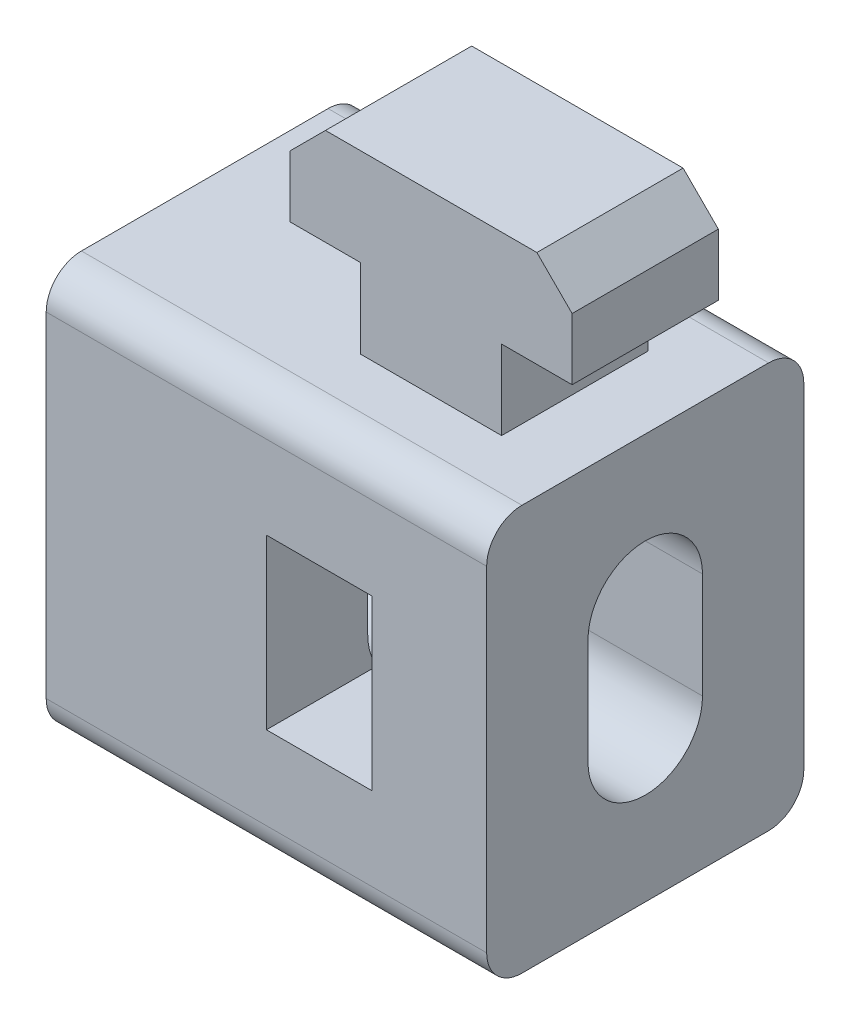
ISO-10303-21;
HEADER;
FILE_DESCRIPTION(('STEP AP214'),'2;1');
FILE_NAME('part.step','',(''),(''),'','','');
FILE_SCHEMA(('AUTOMOTIVE_DESIGN { 1 0 10303 214 1 1 1 1 }'));
ENDSEC;
DATA;
#1=APPLICATION_CONTEXT('core data for automotive mechanical design processes');
#2=APPLICATION_PROTOCOL_DEFINITION('international standard','automotive_design',2000,#1);
#3=PRODUCT_CONTEXT('',#1,'mechanical');
#4=PRODUCT('Part','Part','',(#3));
#5=PRODUCT_RELATED_PRODUCT_CATEGORY('part','',(#4));
#6=PRODUCT_DEFINITION_FORMATION('','',#4);
#7=PRODUCT_DEFINITION_CONTEXT('part definition',#1,'design');
#8=PRODUCT_DEFINITION('design','',#6,#7);
#9=PRODUCT_DEFINITION_SHAPE('','',#8);
#10=(LENGTH_UNIT() NAMED_UNIT(*) SI_UNIT(.MILLI.,.METRE.));
#11=(NAMED_UNIT(*) PLANE_ANGLE_UNIT() SI_UNIT($,.RADIAN.));
#12=(NAMED_UNIT(*) SI_UNIT($,.STERADIAN.) SOLID_ANGLE_UNIT());
#13=UNCERTAINTY_MEASURE_WITH_UNIT(LENGTH_MEASURE(1.E-05),#10,'distance_accuracy_value','');
#14=(GEOMETRIC_REPRESENTATION_CONTEXT(3) GLOBAL_UNCERTAINTY_ASSIGNED_CONTEXT((#13)) GLOBAL_UNIT_ASSIGNED_CONTEXT((#10,
#11,#12)) REPRESENTATION_CONTEXT('',''));
#15=CARTESIAN_POINT('',(0.,0.,0.));
#16=DIRECTION('',(0.,0.,1.));
#17=DIRECTION('',(1.,0.,0.));
#18=AXIS2_PLACEMENT_3D('',#15,#16,#17);
#19=CARTESIAN_POINT('',(-25.,8.5,3.25));
#20=DIRECTION('',(0.,0.,1.));
#21=DIRECTION('',(1.,0.,0.));
#22=AXIS2_PLACEMENT_3D('',#19,#20,#21);
#23=PLANE('',#22);
#24=DIRECTION('',(1.,0.,0.));
#25=VECTOR('',#24,1.);
#26=CARTESIAN_POINT('',(-25.,14.5,3.25));
#27=LINE('',#26,#25);
#28=CARTESIAN_POINT('',(-25.,14.5,3.25));
#29=VERTEX_POINT('',#28);
#30=CARTESIAN_POINT('',(-12.5,14.5,3.25));
#31=VERTEX_POINT('',#30);
#32=EDGE_CURVE('E297',#29,#31,#27,.T.);
#33=ORIENTED_EDGE('',*,*,#32,.T.);
#34=DIRECTION('',(0.,-1.,0.));
#35=VECTOR('',#34,1.);
#36=CARTESIAN_POINT('',(-12.5,8.5,3.25));
#37=LINE('',#36,#35);
#38=CARTESIAN_POINT('',(-12.5,8.5,3.25));
#39=VERTEX_POINT('',#38);
#40=EDGE_CURVE('E262',#31,#39,#37,.T.);
#41=ORIENTED_EDGE('',*,*,#40,.T.);
#42=DIRECTION('',(1.,0.,0.));
#43=VECTOR('',#42,1.);
#44=CARTESIAN_POINT('',(-25.,8.5,3.25));
#45=LINE('',#44,#43);
#46=CARTESIAN_POINT('',(-25.,8.5,3.25));
#47=VERTEX_POINT('',#46);
#48=EDGE_CURVE('E292',#47,#39,#45,.T.);
#49=ORIENTED_EDGE('',*,*,#48,.F.);
#50=DIRECTION('',(0.,-1.,0.));
#51=VECTOR('',#50,1.);
#52=CARTESIAN_POINT('',(-25.,8.5,3.25));
#53=LINE('',#52,#51);
#54=EDGE_CURVE('E279',#29,#47,#53,.T.);
#55=ORIENTED_EDGE('',*,*,#54,.F.);
#56=EDGE_LOOP('',(#33,#41,#49,#55));
#57=FACE_BOUND('',#56,.T.);
#58=ADVANCED_FACE('F37',(#57),#23,.F.);
#59=CARTESIAN_POINT('',(-16.,31.,9.));
#60=DIRECTION('',(0.707106781186548,-0.707106781186547,0.));
#61=DIRECTION('',(0.707106781186547,0.707106781186548,0.));
#62=AXIS2_PLACEMENT_3D('',#59,#60,#61);
#63=PLANE('',#62);
#64=DIRECTION('',(0.,0.,-1.));
#65=VECTOR('',#64,1.);
#66=CARTESIAN_POINT('',(-16.,31.,9.));
#67=LINE('',#66,#65);
#68=CARTESIAN_POINT('',(-16.,31.,4.15));
#69=VERTEX_POINT('',#68);
#70=CARTESIAN_POINT('',(-16.,31.,-4.15));
#71=VERTEX_POINT('',#70);
#72=EDGE_CURVE('E404',#69,#71,#67,.T.);
#73=ORIENTED_EDGE('',*,*,#72,.F.);
#74=DIRECTION('',(0.707106781186547,0.707106781186548,0.));
#75=VECTOR('',#74,1.);
#76=CARTESIAN_POINT('',(-16.,31.,4.15));
#77=LINE('',#76,#75);
#78=CARTESIAN_POINT('',(-14.,33.,4.15));
#79=VERTEX_POINT('',#78);
#80=EDGE_CURVE('E330',#69,#79,#77,.T.);
#81=ORIENTED_EDGE('',*,*,#80,.T.);
#82=DIRECTION('',(0.,0.,-1.));
#83=VECTOR('',#82,1.);
#84=CARTESIAN_POINT('',(-14.,33.,9.));
#85=LINE('',#84,#83);
#86=CARTESIAN_POINT('',(-14.,33.,-4.15));
#87=VERTEX_POINT('',#86);
#88=EDGE_CURVE('E371',#79,#87,#85,.T.);
#89=ORIENTED_EDGE('',*,*,#88,.T.);
#90=DIRECTION('',(-0.707106781186547,-0.707106781186548,0.));
#91=VECTOR('',#90,1.);
#92=CARTESIAN_POINT('',(-16.,31.,-4.15));
#93=LINE('',#92,#91);
#94=EDGE_CURVE('E360',#87,#71,#93,.T.);
#95=ORIENTED_EDGE('',*,*,#94,.T.);
#96=EDGE_LOOP('',(#73,#81,#89,#95));
#97=FACE_BOUND('',#96,.T.);
#98=ADVANCED_FACE('F487',(#97),#63,.F.);
#99=CARTESIAN_POINT('',(-16.,31.,9.));
#100=DIRECTION('',(1.,0.,0.));
#101=DIRECTION('',(0.,0.,-1.));
#102=AXIS2_PLACEMENT_3D('',#99,#100,#101);
#103=PLANE('',#102);
#104=DIRECTION('',(0.,0.,-1.));
#105=VECTOR('',#104,1.);
#106=CARTESIAN_POINT('',(-16.,27.5,9.));
#107=LINE('',#106,#105);
#108=CARTESIAN_POINT('',(-16.,27.5,4.15));
#109=VERTEX_POINT('',#108);
#110=CARTESIAN_POINT('',(-16.,27.5,-4.15));
#111=VERTEX_POINT('',#110);
#112=EDGE_CURVE('E402',#109,#111,#107,.T.);
#113=ORIENTED_EDGE('',*,*,#112,.F.);
#114=DIRECTION('',(0.,1.,0.));
#115=VECTOR('',#114,1.);
#116=CARTESIAN_POINT('',(-16.,31.,4.15));
#117=LINE('',#116,#115);
#118=EDGE_CURVE('E327',#109,#69,#117,.T.);
#119=ORIENTED_EDGE('',*,*,#118,.T.);
#120=ORIENTED_EDGE('',*,*,#72,.T.);
#121=DIRECTION('',(0.,-1.,0.));
#122=VECTOR('',#121,1.);
#123=CARTESIAN_POINT('',(-16.,31.,-4.15));
#124=LINE('',#123,#122);
#125=EDGE_CURVE('E357',#71,#111,#124,.T.);
#126=ORIENTED_EDGE('',*,*,#125,.T.);
#127=EDGE_LOOP('',(#113,#119,#120,#126));
#128=FACE_BOUND('',#127,.T.);
#129=ADVANCED_FACE('F494',(#128),#103,.F.);
#130=CARTESIAN_POINT('',(-16.,27.5,9.));
#131=DIRECTION('',(0.,1.,0.));
#132=DIRECTION('',(0.,0.,1.));
#133=AXIS2_PLACEMENT_3D('',#130,#131,#132);
#134=PLANE('',#133);
#135=DIRECTION('',(0.,0.,-1.));
#136=VECTOR('',#135,1.);
#137=CARTESIAN_POINT('',(-12.,27.5,9.));
#138=LINE('',#137,#136);
#139=CARTESIAN_POINT('',(-12.,27.5,4.15));
#140=VERTEX_POINT('',#139);
#141=CARTESIAN_POINT('',(-12.,27.5,-4.15));
#142=VERTEX_POINT('',#141);
#143=EDGE_CURVE('E400',#140,#142,#138,.T.);
#144=ORIENTED_EDGE('',*,*,#143,.F.);
#145=DIRECTION('',(-1.,0.,0.));
#146=VECTOR('',#145,1.);
#147=CARTESIAN_POINT('',(-16.,27.5,4.15));
#148=LINE('',#147,#146);
#149=EDGE_CURVE('E324',#140,#109,#148,.T.);
#150=ORIENTED_EDGE('',*,*,#149,.T.);
#151=ORIENTED_EDGE('',*,*,#112,.T.);
#152=DIRECTION('',(1.,0.,0.));
#153=VECTOR('',#152,1.);
#154=CARTESIAN_POINT('',(-16.,27.5,-4.15));
#155=LINE('',#154,#153);
#156=EDGE_CURVE('E354',#111,#142,#155,.T.);
#157=ORIENTED_EDGE('',*,*,#156,.T.);
#158=EDGE_LOOP('',(#144,#150,#151,#157));
#159=FACE_BOUND('',#158,.T.);
#160=ADVANCED_FACE('F581',(#159),#134,.F.);
#161=CARTESIAN_POINT('',(-12.,27.5,9.));
#162=DIRECTION('',(1.,0.,0.));
#163=DIRECTION('',(0.,0.,-1.));
#164=AXIS2_PLACEMENT_3D('',#161,#162,#163);
#165=PLANE('',#164);
#166=DIRECTION('',(0.,0.,-1.));
#167=VECTOR('',#166,1.);
#168=CARTESIAN_POINT('',(-12.,23.,9.));
#169=LINE('',#168,#167);
#170=CARTESIAN_POINT('',(-12.,23.,4.15));
#171=VERTEX_POINT('',#170);
#172=CARTESIAN_POINT('',(-12.,23.,-4.15));
#173=VERTEX_POINT('',#172);
#174=EDGE_CURVE('E398',#171,#173,#169,.T.);
#175=ORIENTED_EDGE('',*,*,#174,.F.);
#176=DIRECTION('',(0.,1.,0.));
#177=VECTOR('',#176,1.);
#178=CARTESIAN_POINT('',(-12.,27.5,4.15));
#179=LINE('',#178,#177);
#180=EDGE_CURVE('E321',#171,#140,#179,.T.);
#181=ORIENTED_EDGE('',*,*,#180,.T.);
#182=ORIENTED_EDGE('',*,*,#143,.T.);
#183=DIRECTION('',(0.,-1.,0.));
#184=VECTOR('',#183,1.);
#185=CARTESIAN_POINT('',(-12.,27.5,-4.15));
#186=LINE('',#185,#184);
#187=EDGE_CURVE('E351',#142,#173,#186,.T.);
#188=ORIENTED_EDGE('',*,*,#187,.T.);
#189=EDGE_LOOP('',(#175,#181,#182,#188));
#190=FACE_BOUND('',#189,.T.);
#191=ADVANCED_FACE('F483',(#190),#165,.F.);
#192=CARTESIAN_POINT('',(-25.,23.,9.));
#193=DIRECTION('',(1.,0.,0.));
#194=DIRECTION('',(0.,0.,-1.));
#195=AXIS2_PLACEMENT_3D('',#192,#193,#194);
#196=PLANE('',#195);
#197=ORIENTED_EDGE('',*,*,#54,.T.);
#198=CARTESIAN_POINT('',(-25.,8.5,0.));
#199=DIRECTION('',(1.,0.,0.));
#200=DIRECTION('',(0.,0.,-1.));
#201=AXIS2_PLACEMENT_3D('',#198,#199,#200);
#202=CIRCLE('',#201,3.25);
#203=CARTESIAN_POINT('',(-25.,8.5,-3.25));
#204=VERTEX_POINT('',#203);
#205=EDGE_CURVE('E269',#47,#204,#202,.T.);
#206=ORIENTED_EDGE('',*,*,#205,.T.);
#207=DIRECTION('',(0.,1.,0.));
#208=VECTOR('',#207,1.);
#209=CARTESIAN_POINT('',(-25.,8.5,-3.25));
#210=LINE('',#209,#208);
#211=CARTESIAN_POINT('',(-25.,14.5,-3.25));
#212=VERTEX_POINT('',#211);
#213=EDGE_CURVE('E272',#204,#212,#210,.T.);
#214=ORIENTED_EDGE('',*,*,#213,.T.);
#215=CARTESIAN_POINT('',(-25.,14.5,0.));
#216=DIRECTION('',(1.,0.,0.));
#217=DIRECTION('',(0.,0.,-1.));
#218=AXIS2_PLACEMENT_3D('',#215,#216,#217);
#219=CIRCLE('',#218,3.25);
#220=EDGE_CURVE('E276',#212,#29,#219,.T.);
#221=ORIENTED_EDGE('',*,*,#220,.T.);
#222=EDGE_LOOP('',(#197,#206,#214,#221));
#223=FACE_BOUND('',#222,.T.);
#224=DIRECTION('',(0.,-1.,0.));
#225=VECTOR('',#224,1.);
#226=CARTESIAN_POINT('',(-25.,23.,-9.));
#227=LINE('',#226,#225);
#228=CARTESIAN_POINT('',(-25.,21.,-9.));
#229=VERTEX_POINT('',#228);
#230=CARTESIAN_POINT('',(-25.,2.,-9.));
#231=VERTEX_POINT('',#230);
#232=EDGE_CURVE('E363',#229,#231,#227,.T.);
#233=ORIENTED_EDGE('',*,*,#232,.T.);
#234=CARTESIAN_POINT('',(-25.,2.,-7.));
#235=DIRECTION('',(1.,0.,0.));
#236=DIRECTION('',(0.,0.,-1.));
#237=AXIS2_PLACEMENT_3D('',#234,#235,#236);
#238=CIRCLE('',#237,2.);
#239=CARTESIAN_POINT('',(-25.,0.,-7.));
#240=VERTEX_POINT('',#239);
#241=EDGE_CURVE('E438',#231,#240,#238,.F.);
#242=ORIENTED_EDGE('',*,*,#241,.T.);
#243=DIRECTION('',(0.,0.,-1.));
#244=VECTOR('',#243,1.);
#245=CARTESIAN_POINT('',(-25.,0.,9.));
#246=LINE('',#245,#244);
#247=CARTESIAN_POINT('',(-25.,0.,7.));
#248=VERTEX_POINT('',#247);
#249=EDGE_CURVE('E393',#248,#240,#246,.T.);
#250=ORIENTED_EDGE('',*,*,#249,.F.);
#251=CARTESIAN_POINT('',(-25.,2.,7.));
#252=DIRECTION('',(1.,0.,0.));
#253=DIRECTION('',(0.,0.,-1.));
#254=AXIS2_PLACEMENT_3D('',#251,#252,#253);
#255=CIRCLE('',#254,2.);
#256=CARTESIAN_POINT('',(-25.,2.,9.));
#257=VERTEX_POINT('',#256);
#258=EDGE_CURVE('E435',#248,#257,#255,.F.);
#259=ORIENTED_EDGE('',*,*,#258,.T.);
#260=DIRECTION('',(0.,-1.,0.));
#261=VECTOR('',#260,1.);
#262=CARTESIAN_POINT('',(-25.,23.,9.));
#263=LINE('',#262,#261);
#264=CARTESIAN_POINT('',(-25.,21.,9.));
#265=VERTEX_POINT('',#264);
#266=EDGE_CURVE('E364',#265,#257,#263,.T.);
#267=ORIENTED_EDGE('',*,*,#266,.F.);
#268=CARTESIAN_POINT('',(-25.,21.,7.));
#269=DIRECTION('',(1.,0.,0.));
#270=DIRECTION('',(0.,0.,-1.));
#271=AXIS2_PLACEMENT_3D('',#268,#269,#270);
#272=CIRCLE('',#271,2.);
#273=CARTESIAN_POINT('',(-25.,23.,7.));
#274=VERTEX_POINT('',#273);
#275=EDGE_CURVE('E60',#265,#274,#272,.F.);
#276=ORIENTED_EDGE('',*,*,#275,.T.);
#277=DIRECTION('',(0.,0.,-1.));
#278=VECTOR('',#277,1.);
#279=CARTESIAN_POINT('',(-25.,23.,9.));
#280=LINE('',#279,#278);
#281=CARTESIAN_POINT('',(-25.,23.,-7.));
#282=VERTEX_POINT('',#281);
#283=EDGE_CURVE('E396',#274,#282,#280,.T.);
#284=ORIENTED_EDGE('',*,*,#283,.T.);
#285=CARTESIAN_POINT('',(-25.,21.,-7.));
#286=DIRECTION('',(1.,0.,0.));
#287=DIRECTION('',(0.,0.,-1.));
#288=AXIS2_PLACEMENT_3D('',#285,#286,#287);
#289=CIRCLE('',#288,2.);
#290=EDGE_CURVE('E52',#282,#229,#289,.F.);
#291=ORIENTED_EDGE('',*,*,#290,.T.);
#292=EDGE_LOOP('',(#233,#242,#250,#259,#267,#276,#284,#291));
#293=FACE_BOUND('',#292,.T.);
#294=ADVANCED_FACE('F449',(#223,#293),#196,.F.);
#295=CARTESIAN_POINT('',(0.,0.,9.));
#296=DIRECTION('',(0.,1.,0.));
#297=DIRECTION('',(0.,0.,1.));
#298=AXIS2_PLACEMENT_3D('',#295,#296,#297);
#299=PLANE('',#298);
#300=ORIENTED_EDGE('',*,*,#249,.T.);
#301=DIRECTION('',(1.,0.,0.));
#302=VECTOR('',#301,1.);
#303=CARTESIAN_POINT('',(0.,0.,-7.));
#304=LINE('',#303,#302);
#305=CARTESIAN_POINT('',(0.,0.,-7.));
#306=VERTEX_POINT('',#305);
#307=EDGE_CURVE('E419',#240,#306,#304,.T.);
#308=ORIENTED_EDGE('',*,*,#307,.T.);
#309=DIRECTION('',(0.,0.,-1.));
#310=VECTOR('',#309,1.);
#311=CARTESIAN_POINT('',(0.,0.,9.));
#312=LINE('',#311,#310);
#313=CARTESIAN_POINT('',(0.,0.,7.));
#314=VERTEX_POINT('',#313);
#315=EDGE_CURVE('E390',#314,#306,#312,.T.);
#316=ORIENTED_EDGE('',*,*,#315,.F.);
#317=DIRECTION('',(1.,0.,0.));
#318=VECTOR('',#317,1.);
#319=CARTESIAN_POINT('',(-25.,0.,7.));
#320=LINE('',#319,#318);
#321=EDGE_CURVE('E417',#314,#248,#320,.F.);
#322=ORIENTED_EDGE('',*,*,#321,.T.);
#323=EDGE_LOOP('',(#300,#308,#316,#322));
#324=FACE_BOUND('',#323,.T.);
#325=ADVANCED_FACE('F474',(#324),#299,.F.);
#326=CARTESIAN_POINT('',(0.,23.,9.));
#327=DIRECTION('',(-1.,0.,0.));
#328=DIRECTION('',(0.,0.,1.));
#329=AXIS2_PLACEMENT_3D('',#326,#327,#328);
#330=PLANE('',#329);
#331=DIRECTION('',(0.,1.,0.));
#332=VECTOR('',#331,1.);
#333=CARTESIAN_POINT('',(0.,8.5,-3.25));
#334=LINE('',#333,#332);
#335=CARTESIAN_POINT('',(0.,8.5,-3.25));
#336=VERTEX_POINT('',#335);
#337=CARTESIAN_POINT('',(0.,14.5,-3.25));
#338=VERTEX_POINT('',#337);
#339=EDGE_CURVE('E284',#336,#338,#334,.T.);
#340=ORIENTED_EDGE('',*,*,#339,.F.);
#341=CARTESIAN_POINT('',(0.,8.5,0.));
#342=DIRECTION('',(1.,0.,0.));
#343=DIRECTION('',(0.,0.,-1.));
#344=AXIS2_PLACEMENT_3D('',#341,#342,#343);
#345=CIRCLE('',#344,3.25);
#346=CARTESIAN_POINT('',(0.,8.5,3.25));
#347=VERTEX_POINT('',#346);
#348=EDGE_CURVE('E268',#347,#336,#345,.T.);
#349=ORIENTED_EDGE('',*,*,#348,.F.);
#350=DIRECTION('',(0.,-1.,0.));
#351=VECTOR('',#350,1.);
#352=CARTESIAN_POINT('',(0.,8.5,3.25));
#353=LINE('',#352,#351);
#354=CARTESIAN_POINT('',(0.,14.5,3.25));
#355=VERTEX_POINT('',#354);
#356=EDGE_CURVE('E273',#355,#347,#353,.T.);
#357=ORIENTED_EDGE('',*,*,#356,.F.);
#358=CARTESIAN_POINT('',(0.,14.5,0.));
#359=DIRECTION('',(1.,0.,0.));
#360=DIRECTION('',(0.,0.,-1.));
#361=AXIS2_PLACEMENT_3D('',#358,#359,#360);
#362=CIRCLE('',#361,3.25);
#363=EDGE_CURVE('E287',#338,#355,#362,.T.);
#364=ORIENTED_EDGE('',*,*,#363,.F.);
#365=EDGE_LOOP('',(#340,#349,#357,#364));
#366=FACE_BOUND('',#365,.T.);
#367=ORIENTED_EDGE('',*,*,#315,.T.);
#368=CARTESIAN_POINT('',(0.,2.,-7.));
#369=DIRECTION('',(-1.,0.,0.));
#370=DIRECTION('',(0.,0.,1.));
#371=AXIS2_PLACEMENT_3D('',#368,#369,#370);
#372=CIRCLE('',#371,2.);
#373=CARTESIAN_POINT('',(0.,2.,-9.));
#374=VERTEX_POINT('',#373);
#375=EDGE_CURVE('E428',#306,#374,#372,.F.);
#376=ORIENTED_EDGE('',*,*,#375,.T.);
#377=DIRECTION('',(0.,1.,0.));
#378=VECTOR('',#377,1.);
#379=CARTESIAN_POINT('',(0.,23.,-9.));
#380=LINE('',#379,#378);
#381=CARTESIAN_POINT('',(0.,21.,-9.));
#382=VERTEX_POINT('',#381);
#383=EDGE_CURVE('E368',#374,#382,#380,.T.);
#384=ORIENTED_EDGE('',*,*,#383,.T.);
#385=CARTESIAN_POINT('',(0.,21.,-7.));
#386=DIRECTION('',(-1.,0.,0.));
#387=DIRECTION('',(0.,0.,1.));
#388=AXIS2_PLACEMENT_3D('',#385,#386,#387);
#389=CIRCLE('',#388,2.);
#390=CARTESIAN_POINT('',(0.,23.,-7.));
#391=VERTEX_POINT('',#390);
#392=EDGE_CURVE('E426',#382,#391,#389,.F.);
#393=ORIENTED_EDGE('',*,*,#392,.T.);
#394=DIRECTION('',(0.,0.,-1.));
#395=VECTOR('',#394,1.);
#396=CARTESIAN_POINT('',(0.,23.,9.));
#397=LINE('',#396,#395);
#398=CARTESIAN_POINT('',(0.,23.,7.));
#399=VERTEX_POINT('',#398);
#400=EDGE_CURVE('E387',#399,#391,#397,.T.);
#401=ORIENTED_EDGE('',*,*,#400,.F.);
#402=CARTESIAN_POINT('',(0.,21.,7.));
#403=DIRECTION('',(-1.,0.,0.));
#404=DIRECTION('',(0.,0.,1.));
#405=AXIS2_PLACEMENT_3D('',#402,#403,#404);
#406=CIRCLE('',#405,2.);
#407=CARTESIAN_POINT('',(0.,21.,9.));
#408=VERTEX_POINT('',#407);
#409=EDGE_CURVE('E422',#399,#408,#406,.F.);
#410=ORIENTED_EDGE('',*,*,#409,.T.);
#411=DIRECTION('',(0.,1.,0.));
#412=VECTOR('',#411,1.);
#413=CARTESIAN_POINT('',(0.,23.,9.));
#414=LINE('',#413,#412);
#415=CARTESIAN_POINT('',(0.,2.,9.));
#416=VERTEX_POINT('',#415);
#417=EDGE_CURVE('E367',#416,#408,#414,.T.);
#418=ORIENTED_EDGE('',*,*,#417,.F.);
#419=CARTESIAN_POINT('',(0.,2.,7.));
#420=DIRECTION('',(-1.,0.,0.));
#421=DIRECTION('',(0.,0.,1.));
#422=AXIS2_PLACEMENT_3D('',#419,#420,#421);
#423=CIRCLE('',#422,2.);
#424=EDGE_CURVE('E424',#416,#314,#423,.F.);
#425=ORIENTED_EDGE('',*,*,#424,.T.);
#426=EDGE_LOOP('',(#367,#376,#384,#393,#401,#410,#418,#425));
#427=FACE_BOUND('',#426,.T.);
#428=ADVANCED_FACE('F456',(#366,#427),#330,.F.);
#429=CARTESIAN_POINT('',(-4.,23.,9.));
#430=DIRECTION('',(0.,-1.,0.));
#431=DIRECTION('',(0.,0.,-1.));
#432=AXIS2_PLACEMENT_3D('',#429,#430,#431);
#433=PLANE('',#432);
#434=DIRECTION('',(-1.,0.,0.));
#435=VECTOR('',#434,1.);
#436=CARTESIAN_POINT('',(-19.1094968800872,23.,4.15));
#437=LINE('',#436,#435);
#438=CARTESIAN_POINT('',(-4.,23.,4.15));
#439=VERTEX_POINT('',#438);
#440=EDGE_CURVE('E306',#439,#171,#437,.T.);
#441=ORIENTED_EDGE('',*,*,#440,.T.);
#442=ORIENTED_EDGE('',*,*,#174,.T.);
#443=DIRECTION('',(1.,0.,0.));
#444=VECTOR('',#443,1.);
#445=CARTESIAN_POINT('',(-19.1094968800872,23.,-4.15));
#446=LINE('',#445,#444);
#447=CARTESIAN_POINT('',(-4.,23.,-4.15));
#448=VERTEX_POINT('',#447);
#449=EDGE_CURVE('E336',#173,#448,#446,.T.);
#450=ORIENTED_EDGE('',*,*,#449,.T.);
#451=DIRECTION('',(0.,0.,-1.));
#452=VECTOR('',#451,1.);
#453=CARTESIAN_POINT('',(-4.,23.,9.));
#454=LINE('',#453,#452);
#455=EDGE_CURVE('E385',#439,#448,#454,.T.);
#456=ORIENTED_EDGE('',*,*,#455,.F.);
#457=EDGE_LOOP('',(#441,#442,#450,#456));
#458=FACE_BOUND('',#457,.T.);
#459=ORIENTED_EDGE('',*,*,#400,.T.);
#460=DIRECTION('',(-1.,0.,0.));
#461=VECTOR('',#460,1.);
#462=CARTESIAN_POINT('',(-4.,23.,-7.));
#463=LINE('',#462,#461);
#464=EDGE_CURVE('E442',#391,#282,#463,.T.);
#465=ORIENTED_EDGE('',*,*,#464,.T.);
#466=ORIENTED_EDGE('',*,*,#283,.F.);
#467=DIRECTION('',(-1.,0.,0.));
#468=VECTOR('',#467,1.);
#469=CARTESIAN_POINT('',(0.,23.,7.));
#470=LINE('',#469,#468);
#471=EDGE_CURVE('E440',#274,#399,#470,.F.);
#472=ORIENTED_EDGE('',*,*,#471,.T.);
#473=EDGE_LOOP('',(#459,#465,#466,#472));
#474=FACE_BOUND('',#473,.T.);
#475=ADVANCED_FACE('F461',(#458,#474),#433,.F.);
#476=CARTESIAN_POINT('',(-4.,27.5,9.));
#477=DIRECTION('',(-1.,0.,0.));
#478=DIRECTION('',(0.,0.,1.));
#479=AXIS2_PLACEMENT_3D('',#476,#477,#478);
#480=PLANE('',#479);
#481=DIRECTION('',(0.,0.,-1.));
#482=VECTOR('',#481,1.);
#483=CARTESIAN_POINT('',(-4.,27.5,9.));
#484=LINE('',#483,#482);
#485=CARTESIAN_POINT('',(-4.,27.5,4.15));
#486=VERTEX_POINT('',#485);
#487=CARTESIAN_POINT('',(-4.,27.5,-4.15));
#488=VERTEX_POINT('',#487);
#489=EDGE_CURVE('E383',#486,#488,#484,.T.);
#490=ORIENTED_EDGE('',*,*,#489,.F.);
#491=DIRECTION('',(0.,-1.,0.));
#492=VECTOR('',#491,1.);
#493=CARTESIAN_POINT('',(-4.,27.5,4.15));
#494=LINE('',#493,#492);
#495=EDGE_CURVE('E318',#486,#439,#494,.T.);
#496=ORIENTED_EDGE('',*,*,#495,.T.);
#497=ORIENTED_EDGE('',*,*,#455,.T.);
#498=DIRECTION('',(0.,1.,0.));
#499=VECTOR('',#498,1.);
#500=CARTESIAN_POINT('',(-4.,27.5,-4.15));
#501=LINE('',#500,#499);
#502=EDGE_CURVE('E348',#448,#488,#501,.T.);
#503=ORIENTED_EDGE('',*,*,#502,.T.);
#504=EDGE_LOOP('',(#490,#496,#497,#503));
#505=FACE_BOUND('',#504,.T.);
#506=ADVANCED_FACE('F562',(#505),#480,.F.);
#507=CARTESIAN_POINT('',(-4.,27.5,9.));
#508=DIRECTION('',(0.,1.,0.));
#509=DIRECTION('',(0.,0.,1.));
#510=AXIS2_PLACEMENT_3D('',#507,#508,#509);
#511=PLANE('',#510);
#512=DIRECTION('',(0.,0.,-1.));
#513=VECTOR('',#512,1.);
#514=CARTESIAN_POINT('',(0.,27.5,9.));
#515=LINE('',#514,#513);
#516=CARTESIAN_POINT('',(0.,27.5,4.15));
#517=VERTEX_POINT('',#516);
#518=CARTESIAN_POINT('',(0.,27.5,-4.15));
#519=VERTEX_POINT('',#518);
#520=EDGE_CURVE('E381',#517,#519,#515,.T.);
#521=ORIENTED_EDGE('',*,*,#520,.F.);
#522=DIRECTION('',(-1.,0.,0.));
#523=VECTOR('',#522,1.);
#524=CARTESIAN_POINT('',(-4.,27.5,4.15));
#525=LINE('',#524,#523);
#526=EDGE_CURVE('E315',#517,#486,#525,.T.);
#527=ORIENTED_EDGE('',*,*,#526,.T.);
#528=ORIENTED_EDGE('',*,*,#489,.T.);
#529=DIRECTION('',(1.,0.,0.));
#530=VECTOR('',#529,1.);
#531=CARTESIAN_POINT('',(-4.,27.5,-4.15));
#532=LINE('',#531,#530);
#533=EDGE_CURVE('E345',#488,#519,#532,.T.);
#534=ORIENTED_EDGE('',*,*,#533,.T.);
#535=EDGE_LOOP('',(#521,#527,#528,#534));
#536=FACE_BOUND('',#535,.T.);
#537=ADVANCED_FACE('F558',(#536),#511,.F.);
#538=CARTESIAN_POINT('',(0.,31.,9.));
#539=DIRECTION('',(-1.,0.,0.));
#540=DIRECTION('',(0.,0.,1.));
#541=AXIS2_PLACEMENT_3D('',#538,#539,#540);
#542=PLANE('',#541);
#543=DIRECTION('',(0.,0.,-1.));
#544=VECTOR('',#543,1.);
#545=CARTESIAN_POINT('',(0.,31.,9.));
#546=LINE('',#545,#544);
#547=CARTESIAN_POINT('',(0.,31.,4.15));
#548=VERTEX_POINT('',#547);
#549=CARTESIAN_POINT('',(0.,31.,-4.15));
#550=VERTEX_POINT('',#549);
#551=EDGE_CURVE('E379',#548,#550,#546,.T.);
#552=ORIENTED_EDGE('',*,*,#551,.F.);
#553=DIRECTION('',(0.,-1.,0.));
#554=VECTOR('',#553,1.);
#555=CARTESIAN_POINT('',(0.,31.,4.15));
#556=LINE('',#555,#554);
#557=EDGE_CURVE('E312',#548,#517,#556,.T.);
#558=ORIENTED_EDGE('',*,*,#557,.T.);
#559=ORIENTED_EDGE('',*,*,#520,.T.);
#560=DIRECTION('',(0.,1.,0.));
#561=VECTOR('',#560,1.);
#562=CARTESIAN_POINT('',(0.,-0.815196834172652,-4.15));
#563=LINE('',#562,#561);
#564=EDGE_CURVE('E339',#519,#550,#563,.T.);
#565=ORIENTED_EDGE('',*,*,#564,.T.);
#566=EDGE_LOOP('',(#552,#558,#559,#565));
#567=FACE_BOUND('',#566,.T.);
#568=ADVANCED_FACE('F554',(#567),#542,.F.);
#569=CARTESIAN_POINT('',(0.,31.,9.));
#570=DIRECTION('',(-0.707106781186538,-0.707106781186557,0.));
#571=DIRECTION('',(0.707106781186557,-0.707106781186538,0.));
#572=AXIS2_PLACEMENT_3D('',#569,#570,#571);
#573=PLANE('',#572);
#574=DIRECTION('',(0.,0.,-1.));
#575=VECTOR('',#574,1.);
#576=CARTESIAN_POINT('',(-2.00000000000006,33.,9.));
#577=LINE('',#576,#575);
#578=CARTESIAN_POINT('',(-2.00000000000006,33.,4.15));
#579=VERTEX_POINT('',#578);
#580=CARTESIAN_POINT('',(-2.00000000000006,33.,-4.15));
#581=VERTEX_POINT('',#580);
#582=EDGE_CURVE('E377',#579,#581,#577,.T.);
#583=ORIENTED_EDGE('',*,*,#582,.F.);
#584=DIRECTION('',(0.707106781186557,-0.707106781186538,0.));
#585=VECTOR('',#584,1.);
#586=CARTESIAN_POINT('',(0.,31.,4.15));
#587=LINE('',#586,#585);
#588=EDGE_CURVE('E309',#579,#548,#587,.T.);
#589=ORIENTED_EDGE('',*,*,#588,.T.);
#590=ORIENTED_EDGE('',*,*,#551,.T.);
#591=DIRECTION('',(-0.707106781186557,0.707106781186538,0.));
#592=VECTOR('',#591,1.);
#593=CARTESIAN_POINT('',(0.,31.,-4.15));
#594=LINE('',#593,#592);
#595=EDGE_CURVE('E342',#550,#581,#594,.T.);
#596=ORIENTED_EDGE('',*,*,#595,.T.);
#597=EDGE_LOOP('',(#583,#589,#590,#596));
#598=FACE_BOUND('',#597,.T.);
#599=ADVANCED_FACE('F550',(#598),#573,.F.);
#600=CARTESIAN_POINT('',(-14.,33.,9.));
#601=DIRECTION('',(0.,-1.,0.));
#602=DIRECTION('',(0.,0.,-1.));
#603=AXIS2_PLACEMENT_3D('',#600,#601,#602);
#604=PLANE('',#603);
#605=ORIENTED_EDGE('',*,*,#88,.F.);
#606=DIRECTION('',(-1.,0.,0.));
#607=VECTOR('',#606,1.);
#608=CARTESIAN_POINT('',(-19.1094968800872,33.,4.15));
#609=LINE('',#608,#607);
#610=EDGE_CURVE('E295',#579,#79,#609,.T.);
#611=ORIENTED_EDGE('',*,*,#610,.F.);
#612=ORIENTED_EDGE('',*,*,#582,.T.);
#613=DIRECTION('',(1.,0.,0.));
#614=VECTOR('',#613,1.);
#615=CARTESIAN_POINT('',(-19.1094968800872,33.,-4.15));
#616=LINE('',#615,#614);
#617=EDGE_CURVE('E333',#87,#581,#616,.T.);
#618=ORIENTED_EDGE('',*,*,#617,.F.);
#619=EDGE_LOOP('',(#605,#611,#612,#618));
#620=FACE_BOUND('',#619,.T.);
#621=ADVANCED_FACE('F545',(#620),#604,.F.);
#622=CARTESIAN_POINT('',(0.,0.,9.));
#623=DIRECTION('',(0.,0.,1.));
#624=DIRECTION('',(1.,0.,0.));
#625=AXIS2_PLACEMENT_3D('',#622,#623,#624);
#626=PLANE('',#625);
#627=DIRECTION('',(0.,-1.,0.));
#628=VECTOR('',#627,1.);
#629=CARTESIAN_POINT('',(-12.5,16.285,9.));
#630=LINE('',#629,#628);
#631=CARTESIAN_POINT('',(-12.5,16.285,9.));
#632=VERTEX_POINT('',#631);
#633=CARTESIAN_POINT('',(-12.5,6.715,9.));
#634=VERTEX_POINT('',#633);
#635=EDGE_CURVE('E244',#632,#634,#630,.T.);
#636=ORIENTED_EDGE('',*,*,#635,.F.);
#637=DIRECTION('',(-1.,0.,0.));
#638=VECTOR('',#637,1.);
#639=CARTESIAN_POINT('',(-12.5,16.285,9.));
#640=LINE('',#639,#638);
#641=CARTESIAN_POINT('',(-6.5,16.285,9.));
#642=VERTEX_POINT('',#641);
#643=EDGE_CURVE('E249',#642,#632,#640,.T.);
#644=ORIENTED_EDGE('',*,*,#643,.F.);
#645=DIRECTION('',(0.,1.,0.));
#646=VECTOR('',#645,1.);
#647=CARTESIAN_POINT('',(-6.5,16.285,9.));
#648=LINE('',#647,#646);
#649=CARTESIAN_POINT('',(-6.5,6.715,9.));
#650=VERTEX_POINT('',#649);
#651=EDGE_CURVE('E228',#650,#642,#648,.T.);
#652=ORIENTED_EDGE('',*,*,#651,.F.);
#653=DIRECTION('',(1.,0.,0.));
#654=VECTOR('',#653,1.);
#655=CARTESIAN_POINT('',(-12.5,6.715,9.));
#656=LINE('',#655,#654);
#657=EDGE_CURVE('E239',#634,#650,#656,.T.);
#658=ORIENTED_EDGE('',*,*,#657,.F.);
#659=EDGE_LOOP('',(#636,#644,#652,#658));
#660=FACE_BOUND('',#659,.T.);
#661=ORIENTED_EDGE('',*,*,#266,.T.);
#662=DIRECTION('',(1.,0.,0.));
#663=VECTOR('',#662,1.);
#664=CARTESIAN_POINT('',(0.,2.,9.));
#665=LINE('',#664,#663);
#666=EDGE_CURVE('E11',#257,#416,#665,.T.);
#667=ORIENTED_EDGE('',*,*,#666,.T.);
#668=ORIENTED_EDGE('',*,*,#417,.T.);
#669=DIRECTION('',(-1.,0.,0.));
#670=VECTOR('',#669,1.);
#671=CARTESIAN_POINT('',(-25.,21.,9.));
#672=LINE('',#671,#670);
#673=EDGE_CURVE('E45',#408,#265,#672,.T.);
#674=ORIENTED_EDGE('',*,*,#673,.T.);
#675=EDGE_LOOP('',(#661,#667,#668,#674));
#676=FACE_BOUND('',#675,.T.);
#677=ADVANCED_FACE('F246',(#660,#676),#626,.T.);
#678=CARTESIAN_POINT('',(0.,0.,-9.));
#679=DIRECTION('',(0.,0.,1.));
#680=DIRECTION('',(1.,0.,0.));
#681=AXIS2_PLACEMENT_3D('',#678,#679,#680);
#682=PLANE('',#681);
#683=ORIENTED_EDGE('',*,*,#383,.F.);
#684=DIRECTION('',(1.,0.,0.));
#685=VECTOR('',#684,1.);
#686=CARTESIAN_POINT('',(0.,2.,-9.));
#687=LINE('',#686,#685);
#688=EDGE_CURVE('E432',#374,#231,#687,.F.);
#689=ORIENTED_EDGE('',*,*,#688,.T.);
#690=ORIENTED_EDGE('',*,*,#232,.F.);
#691=DIRECTION('',(-1.,0.,0.));
#692=VECTOR('',#691,1.);
#693=CARTESIAN_POINT('',(0.,21.,-9.));
#694=LINE('',#693,#692);
#695=EDGE_CURVE('E430',#229,#382,#694,.F.);
#696=ORIENTED_EDGE('',*,*,#695,.T.);
#697=EDGE_LOOP('',(#683,#689,#690,#696));
#698=FACE_BOUND('',#697,.T.);
#699=ADVANCED_FACE('F466',(#698),#682,.F.);
#700=CARTESIAN_POINT('',(-19.1094968800872,-0.815196834172652,-4.15));
#701=DIRECTION('',(0.,0.,1.));
#702=DIRECTION('',(1.,0.,0.));
#703=AXIS2_PLACEMENT_3D('',#700,#701,#702);
#704=PLANE('',#703);
#705=ORIENTED_EDGE('',*,*,#617,.T.);
#706=ORIENTED_EDGE('',*,*,#595,.F.);
#707=ORIENTED_EDGE('',*,*,#564,.F.);
#708=ORIENTED_EDGE('',*,*,#533,.F.);
#709=ORIENTED_EDGE('',*,*,#502,.F.);
#710=ORIENTED_EDGE('',*,*,#449,.F.);
#711=ORIENTED_EDGE('',*,*,#187,.F.);
#712=ORIENTED_EDGE('',*,*,#156,.F.);
#713=ORIENTED_EDGE('',*,*,#125,.F.);
#714=ORIENTED_EDGE('',*,*,#94,.F.);
#715=EDGE_LOOP('',(#705,#706,#707,#708,#709,#710,#711,#712,#713,#714));
#716=FACE_BOUND('',#715,.T.);
#717=ADVANCED_FACE('F538',(#716),#704,.F.);
#718=CARTESIAN_POINT('',(-19.1094968800872,-0.815196834172652,4.15));
#719=DIRECTION('',(0.,0.,-1.));
#720=DIRECTION('',(-1.,0.,0.));
#721=AXIS2_PLACEMENT_3D('',#718,#719,#720);
#722=PLANE('',#721);
#723=ORIENTED_EDGE('',*,*,#118,.F.);
#724=ORIENTED_EDGE('',*,*,#149,.F.);
#725=ORIENTED_EDGE('',*,*,#180,.F.);
#726=ORIENTED_EDGE('',*,*,#440,.F.);
#727=ORIENTED_EDGE('',*,*,#495,.F.);
#728=ORIENTED_EDGE('',*,*,#526,.F.);
#729=ORIENTED_EDGE('',*,*,#557,.F.);
#730=ORIENTED_EDGE('',*,*,#588,.F.);
#731=ORIENTED_EDGE('',*,*,#610,.T.);
#732=ORIENTED_EDGE('',*,*,#80,.F.);
#733=EDGE_LOOP('',(#723,#724,#725,#726,#727,#728,#729,#730,#731,#732));
#734=FACE_BOUND('',#733,.T.);
#735=ADVANCED_FACE('F509',(#734),#722,.F.);
#736=CARTESIAN_POINT('',(-25.,8.5,0.));
#737=DIRECTION('',(1.,0.,0.));
#738=DIRECTION('',(0.,0.,-1.));
#739=AXIS2_PLACEMENT_3D('',#736,#737,#738);
#740=CYLINDRICAL_SURFACE('',#739,3.25);
#741=ORIENTED_EDGE('',*,*,#48,.T.);
#742=CARTESIAN_POINT('',(-12.5,8.5,0.));
#743=DIRECTION('',(-1.,0.,0.));
#744=DIRECTION('',(0.,-1.,0.));
#745=AXIS2_PLACEMENT_3D('',#742,#743,#744);
#746=CIRCLE('',#745,3.25);
#747=CARTESIAN_POINT('',(-12.5,6.715,2.71592985918267));
#748=VERTEX_POINT('',#747);
#749=EDGE_CURVE('E265',#39,#748,#746,.F.);
#750=ORIENTED_EDGE('',*,*,#749,.T.);
#751=DIRECTION('',(1.,0.,0.));
#752=VECTOR('',#751,1.);
#753=CARTESIAN_POINT('',(-25.,6.715,2.71592985918267));
#754=LINE('',#753,#752);
#755=CARTESIAN_POINT('',(-6.5,6.715,2.71592985918267));
#756=VERTEX_POINT('',#755);
#757=EDGE_CURVE('E415',#748,#756,#754,.T.);
#758=ORIENTED_EDGE('',*,*,#757,.T.);
#759=CARTESIAN_POINT('',(-6.5,8.5,0.));
#760=DIRECTION('',(1.,0.,0.));
#761=DIRECTION('',(0.,1.,0.));
#762=AXIS2_PLACEMENT_3D('',#759,#760,#761);
#763=CIRCLE('',#762,3.25);
#764=CARTESIAN_POINT('',(-6.5,8.5,3.25));
#765=VERTEX_POINT('',#764);
#766=EDGE_CURVE('E231',#756,#765,#763,.F.);
#767=ORIENTED_EDGE('',*,*,#766,.T.);
#768=EDGE_CURVE('E296',#765,#347,#45,.T.);
#769=ORIENTED_EDGE('',*,*,#768,.T.);
#770=ORIENTED_EDGE('',*,*,#348,.T.);
#771=DIRECTION('',(1.,0.,0.));
#772=VECTOR('',#771,1.);
#773=CARTESIAN_POINT('',(-25.,8.5,-3.25));
#774=LINE('',#773,#772);
#775=EDGE_CURVE('E282',#204,#336,#774,.T.);
#776=ORIENTED_EDGE('',*,*,#775,.F.);
#777=ORIENTED_EDGE('',*,*,#205,.F.);
#778=EDGE_LOOP('',(#741,#750,#758,#767,#769,#770,#776,#777));
#779=FACE_BOUND('',#778,.T.);
#780=ADVANCED_FACE('F501',(#779),#740,.F.);
#781=ORIENTED_EDGE('',*,*,#768,.F.);
#782=DIRECTION('',(0.,1.,0.));
#783=VECTOR('',#782,1.);
#784=CARTESIAN_POINT('',(-6.5,8.5,3.25));
#785=LINE('',#784,#783);
#786=CARTESIAN_POINT('',(-6.5,14.5,3.25));
#787=VERTEX_POINT('',#786);
#788=EDGE_CURVE('E256',#765,#787,#785,.T.);
#789=ORIENTED_EDGE('',*,*,#788,.T.);
#790=EDGE_CURVE('E300',#787,#355,#27,.T.);
#791=ORIENTED_EDGE('',*,*,#790,.T.);
#792=ORIENTED_EDGE('',*,*,#356,.T.);
#793=EDGE_LOOP('',(#781,#789,#791,#792));
#794=FACE_BOUND('',#793,.T.);
#795=ADVANCED_FACE('F490',(#794),#23,.F.);
#796=CARTESIAN_POINT('',(-25.,14.5,0.));
#797=DIRECTION('',(1.,0.,0.));
#798=DIRECTION('',(0.,0.,-1.));
#799=AXIS2_PLACEMENT_3D('',#796,#797,#798);
#800=CYLINDRICAL_SURFACE('',#799,3.25);
#801=DIRECTION('',(1.,0.,0.));
#802=VECTOR('',#801,1.);
#803=CARTESIAN_POINT('',(-25.,16.285,2.71592985918267));
#804=LINE('',#803,#802);
#805=CARTESIAN_POINT('',(-6.5,16.285,2.71592985918267));
#806=VERTEX_POINT('',#805);
#807=CARTESIAN_POINT('',(-12.5,16.285,2.71592985918267));
#808=VERTEX_POINT('',#807);
#809=EDGE_CURVE('E409',#806,#808,#804,.F.);
#810=ORIENTED_EDGE('',*,*,#809,.T.);
#811=CARTESIAN_POINT('',(-12.5,14.5,0.));
#812=DIRECTION('',(-1.,0.,0.));
#813=DIRECTION('',(0.,-1.,0.));
#814=AXIS2_PLACEMENT_3D('',#811,#812,#813);
#815=CIRCLE('',#814,3.25);
#816=EDGE_CURVE('E412',#808,#31,#815,.F.);
#817=ORIENTED_EDGE('',*,*,#816,.T.);
#818=ORIENTED_EDGE('',*,*,#32,.F.);
#819=ORIENTED_EDGE('',*,*,#220,.F.);
#820=DIRECTION('',(1.,0.,0.));
#821=VECTOR('',#820,1.);
#822=CARTESIAN_POINT('',(-25.,14.5,-3.25));
#823=LINE('',#822,#821);
#824=EDGE_CURVE('E301',#212,#338,#823,.T.);
#825=ORIENTED_EDGE('',*,*,#824,.T.);
#826=ORIENTED_EDGE('',*,*,#363,.T.);
#827=ORIENTED_EDGE('',*,*,#790,.F.);
#828=CARTESIAN_POINT('',(-6.5,14.5,0.));
#829=DIRECTION('',(1.,0.,0.));
#830=DIRECTION('',(0.,1.,0.));
#831=AXIS2_PLACEMENT_3D('',#828,#829,#830);
#832=CIRCLE('',#831,3.25);
#833=EDGE_CURVE('E406',#787,#806,#832,.F.);
#834=ORIENTED_EDGE('',*,*,#833,.T.);
#835=EDGE_LOOP('',(#810,#817,#818,#819,#825,#826,#827,#834));
#836=FACE_BOUND('',#835,.T.);
#837=ADVANCED_FACE('F500',(#836),#800,.F.);
#838=CARTESIAN_POINT('',(-25.,8.5,-3.25));
#839=DIRECTION('',(0.,0.,-1.));
#840=DIRECTION('',(-1.,0.,0.));
#841=AXIS2_PLACEMENT_3D('',#838,#839,#840);
#842=PLANE('',#841);
#843=ORIENTED_EDGE('',*,*,#339,.T.);
#844=ORIENTED_EDGE('',*,*,#824,.F.);
#845=ORIENTED_EDGE('',*,*,#213,.F.);
#846=ORIENTED_EDGE('',*,*,#775,.T.);
#847=EDGE_LOOP('',(#843,#844,#845,#846));
#848=FACE_BOUND('',#847,.T.);
#849=ADVANCED_FACE('F507',(#848),#842,.F.);
#850=CARTESIAN_POINT('',(-12.5,6.715,-0.999999999999994));
#851=DIRECTION('',(0.,-1.,0.));
#852=DIRECTION('',(0.,0.,-1.));
#853=AXIS2_PLACEMENT_3D('',#850,#851,#852);
#854=PLANE('',#853);
#855=DIRECTION('',(0.,0.,1.));
#856=VECTOR('',#855,1.);
#857=CARTESIAN_POINT('',(-12.5,6.715,-0.999999999999994));
#858=LINE('',#857,#856);
#859=EDGE_CURVE('E235',#748,#634,#858,.T.);
#860=ORIENTED_EDGE('',*,*,#859,.T.);
#861=ORIENTED_EDGE('',*,*,#657,.T.);
#862=DIRECTION('',(0.,0.,1.));
#863=VECTOR('',#862,1.);
#864=CARTESIAN_POINT('',(-6.5,6.715,-0.999999999999994));
#865=LINE('',#864,#863);
#866=EDGE_CURVE('E224',#756,#650,#865,.T.);
#867=ORIENTED_EDGE('',*,*,#866,.F.);
#868=ORIENTED_EDGE('',*,*,#757,.F.);
#869=EDGE_LOOP('',(#860,#861,#867,#868));
#870=FACE_BOUND('',#869,.T.);
#871=ADVANCED_FACE('F240',(#870),#854,.F.);
#872=CARTESIAN_POINT('',(-12.5,16.285,-0.999999999999994));
#873=DIRECTION('',(-1.,0.,0.));
#874=DIRECTION('',(0.,-1.,0.));
#875=AXIS2_PLACEMENT_3D('',#872,#873,#874);
#876=PLANE('',#875);
#877=ORIENTED_EDGE('',*,*,#40,.F.);
#878=ORIENTED_EDGE('',*,*,#816,.F.);
#879=DIRECTION('',(0.,0.,1.));
#880=VECTOR('',#879,1.);
#881=CARTESIAN_POINT('',(-12.5,16.285,-0.999999999999994));
#882=LINE('',#881,#880);
#883=EDGE_CURVE('E254',#808,#632,#882,.T.);
#884=ORIENTED_EDGE('',*,*,#883,.T.);
#885=ORIENTED_EDGE('',*,*,#635,.T.);
#886=ORIENTED_EDGE('',*,*,#859,.F.);
#887=ORIENTED_EDGE('',*,*,#749,.F.);
#888=EDGE_LOOP('',(#877,#878,#884,#885,#886,#887));
#889=FACE_BOUND('',#888,.T.);
#890=ADVANCED_FACE('F517',(#889),#876,.F.);
#891=CARTESIAN_POINT('',(-12.5,16.285,-0.999999999999994));
#892=DIRECTION('',(0.,1.,0.));
#893=DIRECTION('',(0.,0.,1.));
#894=AXIS2_PLACEMENT_3D('',#891,#892,#893);
#895=PLANE('',#894);
#896=DIRECTION('',(0.,0.,1.));
#897=VECTOR('',#896,1.);
#898=CARTESIAN_POINT('',(-6.5,16.285,-0.999999999999994));
#899=LINE('',#898,#897);
#900=EDGE_CURVE('E234',#806,#642,#899,.T.);
#901=ORIENTED_EDGE('',*,*,#900,.T.);
#902=ORIENTED_EDGE('',*,*,#643,.T.);
#903=ORIENTED_EDGE('',*,*,#883,.F.);
#904=ORIENTED_EDGE('',*,*,#809,.F.);
#905=EDGE_LOOP('',(#901,#902,#903,#904));
#906=FACE_BOUND('',#905,.T.);
#907=ADVANCED_FACE('F521',(#906),#895,.F.);
#908=CARTESIAN_POINT('',(-6.5,16.285,-0.999999999999994));
#909=DIRECTION('',(1.,0.,0.));
#910=DIRECTION('',(0.,1.,0.));
#911=AXIS2_PLACEMENT_3D('',#908,#909,#910);
#912=PLANE('',#911);
#913=ORIENTED_EDGE('',*,*,#866,.T.);
#914=ORIENTED_EDGE('',*,*,#651,.T.);
#915=ORIENTED_EDGE('',*,*,#900,.F.);
#916=ORIENTED_EDGE('',*,*,#833,.F.);
#917=ORIENTED_EDGE('',*,*,#788,.F.);
#918=ORIENTED_EDGE('',*,*,#766,.F.);
#919=EDGE_LOOP('',(#913,#914,#915,#916,#917,#918));
#920=FACE_BOUND('',#919,.T.);
#921=ADVANCED_FACE('F226',(#920),#912,.F.);
#922=CARTESIAN_POINT('',(0.,2.,-7.));
#923=DIRECTION('',(1.,0.,0.));
#924=DIRECTION('',(0.,0.,-1.));
#925=AXIS2_PLACEMENT_3D('',#922,#923,#924);
#926=CYLINDRICAL_SURFACE('',#925,2.);
#927=ORIENTED_EDGE('',*,*,#241,.F.);
#928=ORIENTED_EDGE('',*,*,#688,.F.);
#929=ORIENTED_EDGE('',*,*,#375,.F.);
#930=ORIENTED_EDGE('',*,*,#307,.F.);
#931=EDGE_LOOP('',(#927,#928,#929,#930));
#932=FACE_BOUND('',#931,.T.);
#933=ADVANCED_FACE('F471',(#932),#926,.T.);
#934=CARTESIAN_POINT('',(-4.,21.,-7.));
#935=DIRECTION('',(-1.,0.,0.));
#936=DIRECTION('',(0.,0.,1.));
#937=AXIS2_PLACEMENT_3D('',#934,#935,#936);
#938=CYLINDRICAL_SURFACE('',#937,2.);
#939=ORIENTED_EDGE('',*,*,#392,.F.);
#940=ORIENTED_EDGE('',*,*,#695,.F.);
#941=ORIENTED_EDGE('',*,*,#290,.F.);
#942=ORIENTED_EDGE('',*,*,#464,.F.);
#943=EDGE_LOOP('',(#939,#940,#941,#942));
#944=FACE_BOUND('',#943,.T.);
#945=ADVANCED_FACE('F469',(#944),#938,.T.);
#946=CARTESIAN_POINT('',(0.,2.,7.));
#947=DIRECTION('',(-1.,0.,0.));
#948=DIRECTION('',(0.,0.,1.));
#949=AXIS2_PLACEMENT_3D('',#946,#947,#948);
#950=CYLINDRICAL_SURFACE('',#949,2.);
#951=ORIENTED_EDGE('',*,*,#258,.F.);
#952=ORIENTED_EDGE('',*,*,#321,.F.);
#953=ORIENTED_EDGE('',*,*,#424,.F.);
#954=ORIENTED_EDGE('',*,*,#666,.F.);
#955=EDGE_LOOP('',(#951,#952,#953,#954));
#956=FACE_BOUND('',#955,.T.);
#957=ADVANCED_FACE('F454',(#956),#950,.T.);
#958=CARTESIAN_POINT('',(0.,21.,7.));
#959=DIRECTION('',(1.,0.,0.));
#960=DIRECTION('',(0.,0.,-1.));
#961=AXIS2_PLACEMENT_3D('',#958,#959,#960);
#962=CYLINDRICAL_SURFACE('',#961,2.);
#963=ORIENTED_EDGE('',*,*,#409,.F.);
#964=ORIENTED_EDGE('',*,*,#471,.F.);
#965=ORIENTED_EDGE('',*,*,#275,.F.);
#966=ORIENTED_EDGE('',*,*,#673,.F.);
#967=EDGE_LOOP('',(#963,#964,#965,#966));
#968=FACE_BOUND('',#967,.T.);
#969=ADVANCED_FACE('F39',(#968),#962,.T.);
#970=CLOSED_SHELL('',(#58,#98,#129,#160,#191,#294,#325,#428,#475,#506,#537,#568,#599,#621,#677,
#699,#717,#735,#780,#795,#837,#849,#871,#890,#907,#921,#933,#945,#957,#969));
#971=MANIFOLD_SOLID_BREP('B2',#970);
#972=ADVANCED_BREP_SHAPE_REPRESENTATION('',(#18,#971),#14);
#973=SHAPE_DEFINITION_REPRESENTATION(#9,#972);
ENDSEC;
END-ISO-10303-21;
